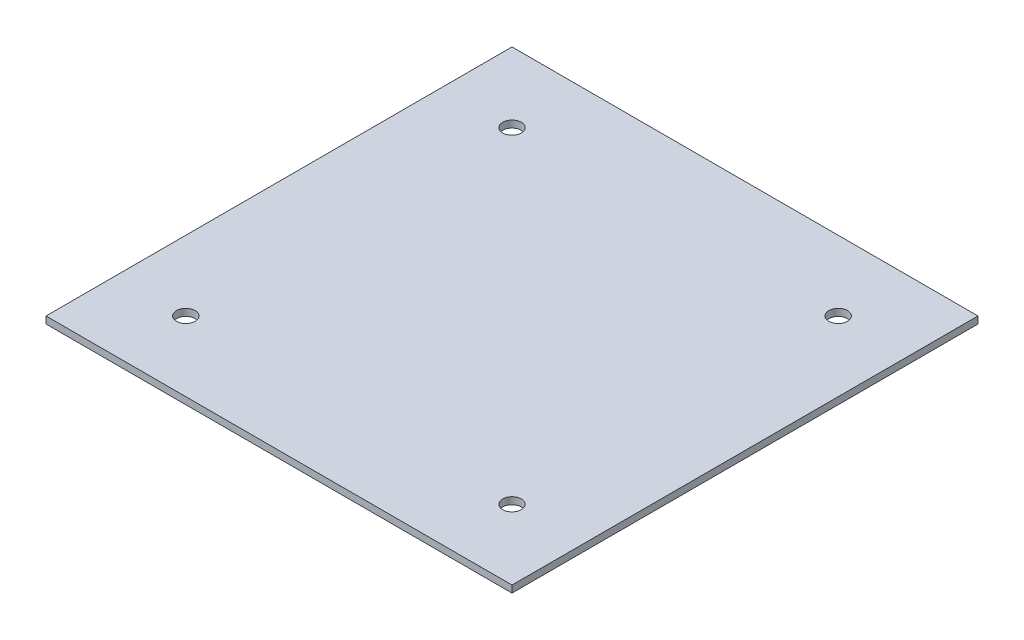
ISO-10303-21;
HEADER;
FILE_DESCRIPTION(('STEP AP214'),'2;1');
FILE_NAME('part.step','',(''),(''),'','','');
FILE_SCHEMA(('AUTOMOTIVE_DESIGN { 1 0 10303 214 1 1 1 1 }'));
ENDSEC;
DATA;
#1=APPLICATION_CONTEXT('core data for automotive mechanical design processes');
#2=APPLICATION_PROTOCOL_DEFINITION('international standard','automotive_design',2000,#1);
#3=PRODUCT_CONTEXT('',#1,'mechanical');
#4=PRODUCT('Part','Part','',(#3));
#5=PRODUCT_RELATED_PRODUCT_CATEGORY('part','',(#4));
#6=PRODUCT_DEFINITION_FORMATION('','',#4);
#7=PRODUCT_DEFINITION_CONTEXT('part definition',#1,'design');
#8=PRODUCT_DEFINITION('design','',#6,#7);
#9=PRODUCT_DEFINITION_SHAPE('','',#8);
#10=(LENGTH_UNIT() NAMED_UNIT(*) SI_UNIT(.MILLI.,.METRE.));
#11=(NAMED_UNIT(*) PLANE_ANGLE_UNIT() SI_UNIT($,.RADIAN.));
#12=(NAMED_UNIT(*) SI_UNIT($,.STERADIAN.) SOLID_ANGLE_UNIT());
#13=UNCERTAINTY_MEASURE_WITH_UNIT(LENGTH_MEASURE(1.E-05),#10,'distance_accuracy_value','');
#14=(GEOMETRIC_REPRESENTATION_CONTEXT(3) GLOBAL_UNCERTAINTY_ASSIGNED_CONTEXT((#13)) GLOBAL_UNIT_ASSIGNED_CONTEXT((#10,
#11,#12)) REPRESENTATION_CONTEXT('',''));
#15=CARTESIAN_POINT('',(0.,0.,0.));
#16=DIRECTION('',(0.,0.,1.));
#17=DIRECTION('',(1.,0.,0.));
#18=AXIS2_PLACEMENT_3D('',#15,#16,#17);
#19=CARTESIAN_POINT('',(0.,3.,0.));
#20=DIRECTION('',(0.,-1.,0.));
#21=DIRECTION('',(0.,0.,-1.));
#22=AXIS2_PLACEMENT_3D('',#19,#20,#21);
#23=PLANE('',#22);
#24=DIRECTION('',(0.,0.,1.));
#25=VECTOR('',#24,1.);
#26=CARTESIAN_POINT('',(0.,3.,0.));
#27=LINE('',#26,#25);
#28=CARTESIAN_POINT('',(0.,3.,-200.));
#29=VERTEX_POINT('',#28);
#30=CARTESIAN_POINT('',(0.,3.,0.));
#31=VERTEX_POINT('',#30);
#32=EDGE_CURVE('E91',#29,#31,#27,.T.);
#33=ORIENTED_EDGE('',*,*,#32,.T.);
#34=DIRECTION('',(1.,0.,0.));
#35=VECTOR('',#34,1.);
#36=CARTESIAN_POINT('',(0.,3.,0.));
#37=LINE('',#36,#35);
#38=CARTESIAN_POINT('',(200.,3.,0.));
#39=VERTEX_POINT('',#38);
#40=EDGE_CURVE('E86',#31,#39,#37,.T.);
#41=ORIENTED_EDGE('',*,*,#40,.T.);
#42=DIRECTION('',(0.,0.,-1.));
#43=VECTOR('',#42,1.);
#44=CARTESIAN_POINT('',(200.,3.,0.));
#45=LINE('',#44,#43);
#46=CARTESIAN_POINT('',(200.,3.,-200.));
#47=VERTEX_POINT('',#46);
#48=EDGE_CURVE('E89',#39,#47,#45,.T.);
#49=ORIENTED_EDGE('',*,*,#48,.T.);
#50=DIRECTION('',(-1.,0.,0.));
#51=VECTOR('',#50,1.);
#52=CARTESIAN_POINT('',(0.,3.,-200.));
#53=LINE('',#52,#51);
#54=EDGE_CURVE('E56',#47,#29,#53,.T.);
#55=ORIENTED_EDGE('',*,*,#54,.T.);
#56=EDGE_LOOP('',(#33,#41,#49,#55));
#57=FACE_BOUND('',#56,.T.);
#58=CARTESIAN_POINT('',(30.,3.,-170.));
#59=DIRECTION('',(0.,1.,0.));
#60=DIRECTION('',(0.,0.,1.));
#61=AXIS2_PLACEMENT_3D('',#58,#59,#60);
#62=CIRCLE('',#61,4.00000000000001);
#63=CARTESIAN_POINT('',(30.,3.,-166.));
#64=VERTEX_POINT('',#63);
#65=EDGE_CURVE('E106',#64,#64,#62,.T.);
#66=ORIENTED_EDGE('',*,*,#65,.F.);
#67=EDGE_LOOP('',(#66));
#68=FACE_BOUND('',#67,.T.);
#69=CARTESIAN_POINT('',(170.,3.,-170.));
#70=DIRECTION('',(0.,1.,0.));
#71=DIRECTION('',(0.,0.,1.));
#72=AXIS2_PLACEMENT_3D('',#69,#70,#71);
#73=CIRCLE('',#72,4.00000000000002);
#74=CARTESIAN_POINT('',(170.,3.,-166.));
#75=VERTEX_POINT('',#74);
#76=EDGE_CURVE('E121',#75,#75,#73,.T.);
#77=ORIENTED_EDGE('',*,*,#76,.F.);
#78=EDGE_LOOP('',(#77));
#79=FACE_BOUND('',#78,.T.);
#80=CARTESIAN_POINT('',(170.000000000001,3.,-30.));
#81=DIRECTION('',(0.,1.,0.));
#82=DIRECTION('',(0.,0.,1.));
#83=AXIS2_PLACEMENT_3D('',#80,#81,#82);
#84=CIRCLE('',#83,4.00000000000002);
#85=CARTESIAN_POINT('',(170.000000000001,3.,-26.));
#86=VERTEX_POINT('',#85);
#87=EDGE_CURVE('E127',#86,#86,#84,.T.);
#88=ORIENTED_EDGE('',*,*,#87,.F.);
#89=EDGE_LOOP('',(#88));
#90=FACE_BOUND('',#89,.T.);
#91=CARTESIAN_POINT('',(30.0000000000015,3.,-30.));
#92=DIRECTION('',(0.,1.,0.));
#93=DIRECTION('',(0.,0.,1.));
#94=AXIS2_PLACEMENT_3D('',#91,#92,#93);
#95=CIRCLE('',#94,4.00000000000001);
#96=CARTESIAN_POINT('',(30.0000000000015,3.,-26.));
#97=VERTEX_POINT('',#96);
#98=EDGE_CURVE('E133',#97,#97,#95,.T.);
#99=ORIENTED_EDGE('',*,*,#98,.F.);
#100=EDGE_LOOP('',(#99));
#101=FACE_BOUND('',#100,.T.);
#102=ADVANCED_FACE('F39',(#57,#68,#79,#90,#101),#23,.F.);
#103=CARTESIAN_POINT('',(0.,0.,0.));
#104=DIRECTION('',(0.,-1.,0.));
#105=DIRECTION('',(0.,0.,-1.));
#106=AXIS2_PLACEMENT_3D('',#103,#104,#105);
#107=PLANE('',#106);
#108=CARTESIAN_POINT('',(170.000000000001,0.,-30.));
#109=DIRECTION('',(0.,1.,0.));
#110=DIRECTION('',(0.,0.,1.));
#111=AXIS2_PLACEMENT_3D('',#108,#109,#110);
#112=CIRCLE('',#111,4.00000000000002);
#113=CARTESIAN_POINT('',(170.000000000001,0.,-26.));
#114=VERTEX_POINT('',#113);
#115=EDGE_CURVE('E130',#114,#114,#112,.T.);
#116=ORIENTED_EDGE('',*,*,#115,.T.);
#117=EDGE_LOOP('',(#116));
#118=FACE_BOUND('',#117,.T.);
#119=CARTESIAN_POINT('',(30.,0.,-170.));
#120=DIRECTION('',(0.,1.,0.));
#121=DIRECTION('',(0.,0.,1.));
#122=AXIS2_PLACEMENT_3D('',#119,#120,#121);
#123=CIRCLE('',#122,4.00000000000001);
#124=CARTESIAN_POINT('',(30.,0.,-166.));
#125=VERTEX_POINT('',#124);
#126=EDGE_CURVE('E118',#125,#125,#123,.T.);
#127=ORIENTED_EDGE('',*,*,#126,.T.);
#128=EDGE_LOOP('',(#127));
#129=FACE_BOUND('',#128,.T.);
#130=DIRECTION('',(0.,0.,1.));
#131=VECTOR('',#130,1.);
#132=CARTESIAN_POINT('',(0.,0.,0.));
#133=LINE('',#132,#131);
#134=CARTESIAN_POINT('',(0.,0.,-200.));
#135=VERTEX_POINT('',#134);
#136=CARTESIAN_POINT('',(0.,0.,0.));
#137=VERTEX_POINT('',#136);
#138=EDGE_CURVE('E103',#135,#137,#133,.T.);
#139=ORIENTED_EDGE('',*,*,#138,.F.);
#140=DIRECTION('',(-1.,0.,0.));
#141=VECTOR('',#140,1.);
#142=CARTESIAN_POINT('',(0.,0.,-200.));
#143=LINE('',#142,#141);
#144=CARTESIAN_POINT('',(200.,0.,-200.));
#145=VERTEX_POINT('',#144);
#146=EDGE_CURVE('E79',#145,#135,#143,.T.);
#147=ORIENTED_EDGE('',*,*,#146,.F.);
#148=DIRECTION('',(0.,0.,-1.));
#149=VECTOR('',#148,1.);
#150=CARTESIAN_POINT('',(200.,0.,0.));
#151=LINE('',#150,#149);
#152=CARTESIAN_POINT('',(200.,0.,0.));
#153=VERTEX_POINT('',#152);
#154=EDGE_CURVE('E73',#153,#145,#151,.T.);
#155=ORIENTED_EDGE('',*,*,#154,.F.);
#156=DIRECTION('',(1.,0.,0.));
#157=VECTOR('',#156,1.);
#158=CARTESIAN_POINT('',(0.,0.,0.));
#159=LINE('',#158,#157);
#160=EDGE_CURVE('E95',#137,#153,#159,.T.);
#161=ORIENTED_EDGE('',*,*,#160,.F.);
#162=EDGE_LOOP('',(#139,#147,#155,#161));
#163=FACE_BOUND('',#162,.T.);
#164=CARTESIAN_POINT('',(170.,0.,-170.));
#165=DIRECTION('',(0.,1.,0.));
#166=DIRECTION('',(0.,0.,1.));
#167=AXIS2_PLACEMENT_3D('',#164,#165,#166);
#168=CIRCLE('',#167,4.00000000000002);
#169=CARTESIAN_POINT('',(170.,0.,-166.));
#170=VERTEX_POINT('',#169);
#171=EDGE_CURVE('E124',#170,#170,#168,.T.);
#172=ORIENTED_EDGE('',*,*,#171,.T.);
#173=EDGE_LOOP('',(#172));
#174=FACE_BOUND('',#173,.T.);
#175=CARTESIAN_POINT('',(30.0000000000015,0.,-30.));
#176=DIRECTION('',(0.,1.,0.));
#177=DIRECTION('',(0.,0.,1.));
#178=AXIS2_PLACEMENT_3D('',#175,#176,#177);
#179=CIRCLE('',#178,4.00000000000001);
#180=CARTESIAN_POINT('',(30.0000000000015,0.,-26.));
#181=VERTEX_POINT('',#180);
#182=EDGE_CURVE('E136',#181,#181,#179,.T.);
#183=ORIENTED_EDGE('',*,*,#182,.T.);
#184=EDGE_LOOP('',(#183));
#185=FACE_BOUND('',#184,.T.);
#186=ADVANCED_FACE('F114',(#118,#129,#163,#174,#185),#107,.T.);
#187=CARTESIAN_POINT('',(0.,3.,0.));
#188=DIRECTION('',(1.,0.,0.));
#189=DIRECTION('',(0.,0.,-1.));
#190=AXIS2_PLACEMENT_3D('',#187,#188,#189);
#191=PLANE('',#190);
#192=ORIENTED_EDGE('',*,*,#138,.T.);
#193=DIRECTION('',(0.,-1.,0.));
#194=VECTOR('',#193,1.);
#195=CARTESIAN_POINT('',(0.,3.,0.));
#196=LINE('',#195,#194);
#197=EDGE_CURVE('E11',#31,#137,#196,.T.);
#198=ORIENTED_EDGE('',*,*,#197,.F.);
#199=ORIENTED_EDGE('',*,*,#32,.F.);
#200=DIRECTION('',(0.,-1.,0.));
#201=VECTOR('',#200,1.);
#202=CARTESIAN_POINT('',(0.,3.,-200.));
#203=LINE('',#202,#201);
#204=EDGE_CURVE('E99',#29,#135,#203,.T.);
#205=ORIENTED_EDGE('',*,*,#204,.T.);
#206=EDGE_LOOP('',(#192,#198,#199,#205));
#207=FACE_BOUND('',#206,.T.);
#208=ADVANCED_FACE('F41',(#207),#191,.F.);
#209=CARTESIAN_POINT('',(0.,3.,0.));
#210=DIRECTION('',(0.,0.,-1.));
#211=DIRECTION('',(-1.,0.,0.));
#212=AXIS2_PLACEMENT_3D('',#209,#210,#211);
#213=PLANE('',#212);
#214=ORIENTED_EDGE('',*,*,#160,.T.);
#215=DIRECTION('',(0.,-1.,0.));
#216=VECTOR('',#215,1.);
#217=CARTESIAN_POINT('',(200.,3.,0.));
#218=LINE('',#217,#216);
#219=EDGE_CURVE('E48',#39,#153,#218,.T.);
#220=ORIENTED_EDGE('',*,*,#219,.F.);
#221=ORIENTED_EDGE('',*,*,#40,.F.);
#222=ORIENTED_EDGE('',*,*,#197,.T.);
#223=EDGE_LOOP('',(#214,#220,#221,#222));
#224=FACE_BOUND('',#223,.T.);
#225=ADVANCED_FACE('F94',(#224),#213,.F.);
#226=CARTESIAN_POINT('',(200.,3.,0.));
#227=DIRECTION('',(-1.,0.,0.));
#228=DIRECTION('',(0.,0.,1.));
#229=AXIS2_PLACEMENT_3D('',#226,#227,#228);
#230=PLANE('',#229);
#231=ORIENTED_EDGE('',*,*,#154,.T.);
#232=DIRECTION('',(0.,-1.,0.));
#233=VECTOR('',#232,1.);
#234=CARTESIAN_POINT('',(200.,3.,-200.));
#235=LINE('',#234,#233);
#236=EDGE_CURVE('E96',#47,#145,#235,.T.);
#237=ORIENTED_EDGE('',*,*,#236,.F.);
#238=ORIENTED_EDGE('',*,*,#48,.F.);
#239=ORIENTED_EDGE('',*,*,#219,.T.);
#240=EDGE_LOOP('',(#231,#237,#238,#239));
#241=FACE_BOUND('',#240,.T.);
#242=ADVANCED_FACE('F97',(#241),#230,.F.);
#243=CARTESIAN_POINT('',(0.,3.,-200.));
#244=DIRECTION('',(0.,0.,1.));
#245=DIRECTION('',(1.,0.,0.));
#246=AXIS2_PLACEMENT_3D('',#243,#244,#245);
#247=PLANE('',#246);
#248=ORIENTED_EDGE('',*,*,#146,.T.);
#249=ORIENTED_EDGE('',*,*,#204,.F.);
#250=ORIENTED_EDGE('',*,*,#54,.F.);
#251=ORIENTED_EDGE('',*,*,#236,.T.);
#252=EDGE_LOOP('',(#248,#249,#250,#251));
#253=FACE_BOUND('',#252,.T.);
#254=ADVANCED_FACE('F111',(#253),#247,.F.);
#255=CARTESIAN_POINT('',(30.,3.,-170.));
#256=DIRECTION('',(0.,-1.,0.));
#257=DIRECTION('',(0.,0.,-1.));
#258=AXIS2_PLACEMENT_3D('',#255,#256,#257);
#259=CYLINDRICAL_SURFACE('',#258,4.00000000000001);
#260=ORIENTED_EDGE('',*,*,#65,.T.);
#261=EDGE_LOOP('',(#260));
#262=FACE_BOUND('',#261,.T.);
#263=ORIENTED_EDGE('',*,*,#126,.F.);
#264=EDGE_LOOP('',(#263));
#265=FACE_BOUND('',#264,.T.);
#266=ADVANCED_FACE('F153',(#262,#265),#259,.F.);
#267=CARTESIAN_POINT('',(170.,3.,-170.));
#268=DIRECTION('',(0.,-1.,0.));
#269=DIRECTION('',(0.,0.,-1.));
#270=AXIS2_PLACEMENT_3D('',#267,#268,#269);
#271=CYLINDRICAL_SURFACE('',#270,4.00000000000002);
#272=ORIENTED_EDGE('',*,*,#76,.T.);
#273=EDGE_LOOP('',(#272));
#274=FACE_BOUND('',#273,.T.);
#275=ORIENTED_EDGE('',*,*,#171,.F.);
#276=EDGE_LOOP('',(#275));
#277=FACE_BOUND('',#276,.T.);
#278=ADVANCED_FACE('F198',(#274,#277),#271,.F.);
#279=CARTESIAN_POINT('',(170.000000000001,3.,-30.));
#280=DIRECTION('',(0.,-1.,0.));
#281=DIRECTION('',(0.,0.,-1.));
#282=AXIS2_PLACEMENT_3D('',#279,#280,#281);
#283=CYLINDRICAL_SURFACE('',#282,4.00000000000002);
#284=ORIENTED_EDGE('',*,*,#87,.T.);
#285=EDGE_LOOP('',(#284));
#286=FACE_BOUND('',#285,.T.);
#287=ORIENTED_EDGE('',*,*,#115,.F.);
#288=EDGE_LOOP('',(#287));
#289=FACE_BOUND('',#288,.T.);
#290=ADVANCED_FACE('F206',(#286,#289),#283,.F.);
#291=CARTESIAN_POINT('',(30.0000000000015,3.,-30.));
#292=DIRECTION('',(0.,-1.,0.));
#293=DIRECTION('',(0.,0.,-1.));
#294=AXIS2_PLACEMENT_3D('',#291,#292,#293);
#295=CYLINDRICAL_SURFACE('',#294,4.00000000000001);
#296=ORIENTED_EDGE('',*,*,#98,.T.);
#297=EDGE_LOOP('',(#296));
#298=FACE_BOUND('',#297,.T.);
#299=ORIENTED_EDGE('',*,*,#182,.F.);
#300=EDGE_LOOP('',(#299));
#301=FACE_BOUND('',#300,.T.);
#302=ADVANCED_FACE('F142',(#298,#301),#295,.F.);
#303=CLOSED_SHELL('',(#102,#186,#208,#225,#242,#254,#266,#278,#290,#302));
#304=MANIFOLD_SOLID_BREP('B2',#303);
#305=ADVANCED_BREP_SHAPE_REPRESENTATION('',(#18,#304),#14);
#306=SHAPE_DEFINITION_REPRESENTATION(#9,#305);
ENDSEC;
END-ISO-10303-21;
